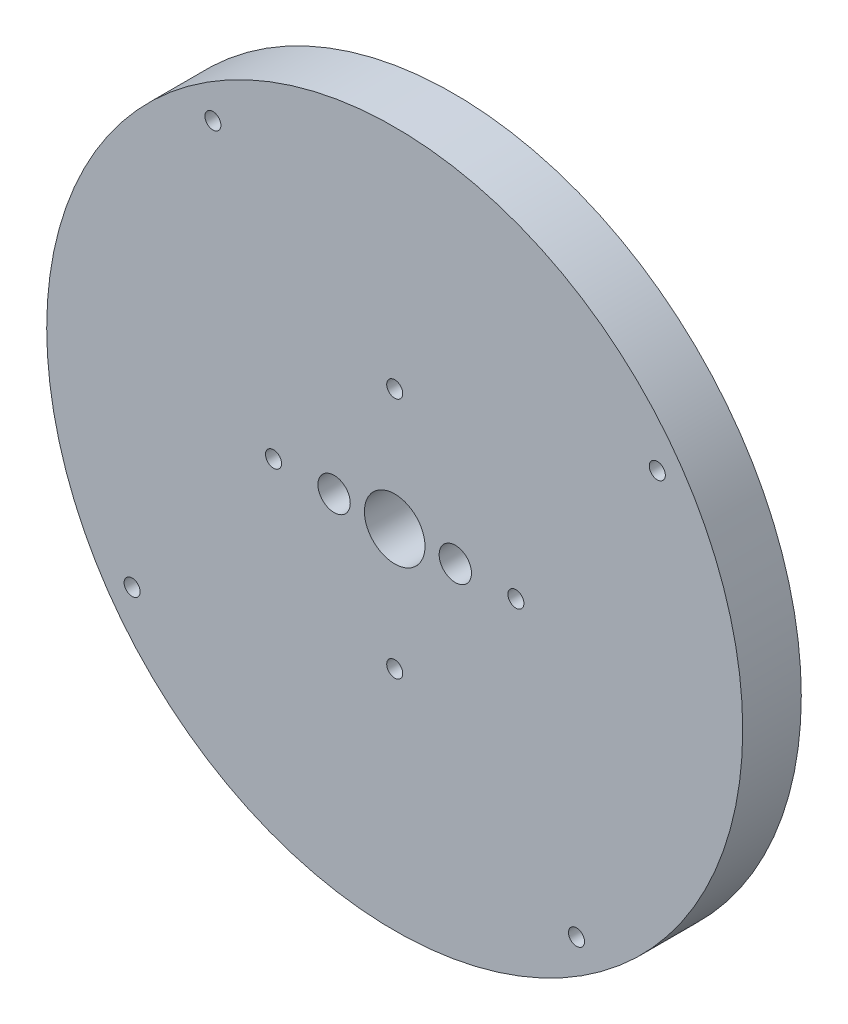
ISO-10303-21;
HEADER;
FILE_DESCRIPTION(('STEP AP214'),'2;1');
FILE_NAME('part.step','',(''),(''),'','','');
FILE_SCHEMA(('AUTOMOTIVE_DESIGN { 1 0 10303 214 1 1 1 1 }'));
ENDSEC;
DATA;
#1=APPLICATION_CONTEXT('core data for automotive mechanical design processes');
#2=APPLICATION_PROTOCOL_DEFINITION('international standard','automotive_design',2000,#1);
#3=PRODUCT_CONTEXT('',#1,'mechanical');
#4=PRODUCT('Part','Part','',(#3));
#5=PRODUCT_RELATED_PRODUCT_CATEGORY('part','',(#4));
#6=PRODUCT_DEFINITION_FORMATION('','',#4);
#7=PRODUCT_DEFINITION_CONTEXT('part definition',#1,'design');
#8=PRODUCT_DEFINITION('design','',#6,#7);
#9=PRODUCT_DEFINITION_SHAPE('','',#8);
#10=(LENGTH_UNIT() NAMED_UNIT(*) SI_UNIT(.MILLI.,.METRE.));
#11=(NAMED_UNIT(*) PLANE_ANGLE_UNIT() SI_UNIT($,.RADIAN.));
#12=(NAMED_UNIT(*) SI_UNIT($,.STERADIAN.) SOLID_ANGLE_UNIT());
#13=UNCERTAINTY_MEASURE_WITH_UNIT(LENGTH_MEASURE(1.E-05),#10,'distance_accuracy_value','');
#14=(GEOMETRIC_REPRESENTATION_CONTEXT(3) GLOBAL_UNCERTAINTY_ASSIGNED_CONTEXT((#13)) GLOBAL_UNIT_ASSIGNED_CONTEXT((#10,
#11,#12)) REPRESENTATION_CONTEXT('',''));
#15=CARTESIAN_POINT('',(0.,0.,0.));
#16=DIRECTION('',(0.,0.,1.));
#17=DIRECTION('',(1.,0.,0.));
#18=AXIS2_PLACEMENT_3D('',#15,#16,#17);
#19=CARTESIAN_POINT('',(0.,0.,5.8));
#20=DIRECTION('',(0.,0.,1.));
#21=DIRECTION('',(1.,0.,0.));
#22=AXIS2_PLACEMENT_3D('',#19,#20,#21);
#23=PLANE('',#22);
#24=CARTESIAN_POINT('',(-6.,0.,5.8));
#25=DIRECTION('',(0.,0.,1.));
#26=DIRECTION('',(1.,0.,0.));
#27=AXIS2_PLACEMENT_3D('',#24,#25,#26);
#28=CIRCLE('',#27,1.59999999999999);
#29=CARTESIAN_POINT('',(-4.40000000000001,0.,5.8));
#30=VERTEX_POINT('',#29);
#31=EDGE_CURVE('E63',#30,#30,#28,.T.);
#32=ORIENTED_EDGE('',*,*,#31,.F.);
#33=EDGE_LOOP('',(#32));
#34=FACE_BOUND('',#33,.T.);
#35=CARTESIAN_POINT('',(6.,0.,5.8));
#36=DIRECTION('',(0.,0.,1.));
#37=DIRECTION('',(1.,0.,0.));
#38=AXIS2_PLACEMENT_3D('',#35,#36,#37);
#39=CIRCLE('',#38,1.59999999999999);
#40=CARTESIAN_POINT('',(7.59999999999999,0.,5.8));
#41=VERTEX_POINT('',#40);
#42=EDGE_CURVE('E52',#41,#41,#39,.T.);
#43=ORIENTED_EDGE('',*,*,#42,.F.);
#44=EDGE_LOOP('',(#43));
#45=FACE_BOUND('',#44,.T.);
#46=CARTESIAN_POINT('',(-26.,-18.,5.8));
#47=DIRECTION('',(0.,0.,1.));
#48=DIRECTION('',(1.,0.,0.));
#49=AXIS2_PLACEMENT_3D('',#46,#47,#48);
#50=CIRCLE('',#49,0.793749999999999);
#51=CARTESIAN_POINT('',(-25.20625,-18.,5.8));
#52=VERTEX_POINT('',#51);
#53=EDGE_CURVE('E51',#52,#52,#50,.T.);
#54=ORIENTED_EDGE('',*,*,#53,.F.);
#55=EDGE_LOOP('',(#54));
#56=FACE_BOUND('',#55,.T.);
#57=CARTESIAN_POINT('',(18.,-26.,5.8));
#58=DIRECTION('',(0.,0.,1.));
#59=DIRECTION('',(1.,0.,0.));
#60=AXIS2_PLACEMENT_3D('',#57,#58,#59);
#61=CIRCLE('',#60,0.793749999999999);
#62=CARTESIAN_POINT('',(18.79375,-26.,5.8));
#63=VERTEX_POINT('',#62);
#64=EDGE_CURVE('E67',#63,#63,#61,.T.);
#65=ORIENTED_EDGE('',*,*,#64,.F.);
#66=EDGE_LOOP('',(#65));
#67=FACE_BOUND('',#66,.T.);
#68=CARTESIAN_POINT('',(26.,18.,5.8));
#69=DIRECTION('',(0.,0.,1.));
#70=DIRECTION('',(1.,0.,0.));
#71=AXIS2_PLACEMENT_3D('',#68,#69,#70);
#72=CIRCLE('',#71,0.793750000000094);
#73=CARTESIAN_POINT('',(26.7937500000001,18.,5.8));
#74=VERTEX_POINT('',#73);
#75=EDGE_CURVE('E72',#74,#74,#72,.T.);
#76=ORIENTED_EDGE('',*,*,#75,.F.);
#77=EDGE_LOOP('',(#76));
#78=FACE_BOUND('',#77,.T.);
#79=CARTESIAN_POINT('',(-11.9999999999998,-1.77032234820136E-13,5.8));
#80=DIRECTION('',(0.,0.,1.));
#81=DIRECTION('',(1.,0.,0.));
#82=AXIS2_PLACEMENT_3D('',#79,#80,#81);
#83=CIRCLE('',#82,0.793749999999992);
#84=CARTESIAN_POINT('',(-11.2062499999998,-1.77032234820136E-13,5.8));
#85=VERTEX_POINT('',#84);
#86=EDGE_CURVE('E78',#85,#85,#83,.T.);
#87=ORIENTED_EDGE('',*,*,#86,.F.);
#88=EDGE_LOOP('',(#87));
#89=FACE_BOUND('',#88,.T.);
#90=CARTESIAN_POINT('',(0.,-12.,5.8));
#91=DIRECTION('',(0.,0.,1.));
#92=DIRECTION('',(1.,0.,0.));
#93=AXIS2_PLACEMENT_3D('',#90,#91,#92);
#94=CIRCLE('',#93,0.79375);
#95=CARTESIAN_POINT('',(0.79375,-12.,5.8));
#96=VERTEX_POINT('',#95);
#97=EDGE_CURVE('E84',#96,#96,#94,.T.);
#98=ORIENTED_EDGE('',*,*,#97,.F.);
#99=EDGE_LOOP('',(#98));
#100=FACE_BOUND('',#99,.T.);
#101=CARTESIAN_POINT('',(12.0000000000002,0.,5.8));
#102=DIRECTION('',(0.,0.,1.));
#103=DIRECTION('',(1.,0.,0.));
#104=AXIS2_PLACEMENT_3D('',#101,#102,#103);
#105=CIRCLE('',#104,0.793749999999999);
#106=CARTESIAN_POINT('',(12.7937500000002,0.,5.8));
#107=VERTEX_POINT('',#106);
#108=EDGE_CURVE('E90',#107,#107,#105,.T.);
#109=ORIENTED_EDGE('',*,*,#108,.F.);
#110=EDGE_LOOP('',(#109));
#111=FACE_BOUND('',#110,.T.);
#112=CARTESIAN_POINT('',(-18.,26.,5.8));
#113=DIRECTION('',(0.,0.,1.));
#114=DIRECTION('',(1.,0.,0.));
#115=AXIS2_PLACEMENT_3D('',#112,#113,#114);
#116=CIRCLE('',#115,0.793749999999999);
#117=CARTESIAN_POINT('',(-17.20625,26.,5.8));
#118=VERTEX_POINT('',#117);
#119=EDGE_CURVE('E96',#118,#118,#116,.T.);
#120=ORIENTED_EDGE('',*,*,#119,.F.);
#121=EDGE_LOOP('',(#120));
#122=FACE_BOUND('',#121,.T.);
#123=CARTESIAN_POINT('',(0.,12.,5.8));
#124=DIRECTION('',(0.,0.,1.));
#125=DIRECTION('',(1.,0.,0.));
#126=AXIS2_PLACEMENT_3D('',#123,#124,#125);
#127=CIRCLE('',#126,0.79375);
#128=CARTESIAN_POINT('',(0.79375,12.,5.8));
#129=VERTEX_POINT('',#128);
#130=EDGE_CURVE('E102',#129,#129,#127,.T.);
#131=ORIENTED_EDGE('',*,*,#130,.F.);
#132=EDGE_LOOP('',(#131));
#133=FACE_BOUND('',#132,.T.);
#134=CARTESIAN_POINT('',(0.,0.,5.8));
#135=DIRECTION('',(0.,0.,1.));
#136=DIRECTION('',(1.,0.,0.));
#137=AXIS2_PLACEMENT_3D('',#134,#135,#136);
#138=CIRCLE('',#137,34.4583333333333);
#139=CARTESIAN_POINT('',(34.4583333333333,0.,5.8));
#140=VERTEX_POINT('',#139);
#141=EDGE_CURVE('E10',#140,#140,#138,.T.);
#142=ORIENTED_EDGE('',*,*,#141,.T.);
#143=EDGE_LOOP('',(#142));
#144=FACE_BOUND('',#143,.T.);
#145=CARTESIAN_POINT('',(0.,0.,5.8));
#146=DIRECTION('',(0.,0.,1.));
#147=DIRECTION('',(1.,0.,0.));
#148=AXIS2_PLACEMENT_3D('',#145,#146,#147);
#149=CIRCLE('',#148,3.);
#150=CARTESIAN_POINT('',(3.,0.,5.8));
#151=VERTEX_POINT('',#150);
#152=EDGE_CURVE('E44',#151,#151,#149,.T.);
#153=ORIENTED_EDGE('',*,*,#152,.F.);
#154=EDGE_LOOP('',(#153));
#155=FACE_BOUND('',#154,.T.);
#156=ADVANCED_FACE('F31',(#34,#45,#56,#67,#78,#89,#100,#111,#122,#133,#144,#155),#23,.T.);
#157=CARTESIAN_POINT('',(0.,0.,0.));
#158=DIRECTION('',(0.,0.,1.));
#159=DIRECTION('',(1.,0.,0.));
#160=AXIS2_PLACEMENT_3D('',#157,#158,#159);
#161=PLANE('',#160);
#162=CARTESIAN_POINT('',(-6.,0.,0.));
#163=DIRECTION('',(0.,0.,1.));
#164=DIRECTION('',(1.,0.,0.));
#165=AXIS2_PLACEMENT_3D('',#162,#163,#164);
#166=CIRCLE('',#165,1.59999999999999);
#167=CARTESIAN_POINT('',(-4.40000000000001,0.,0.));
#168=VERTEX_POINT('',#167);
#169=EDGE_CURVE('E35',#168,#168,#166,.T.);
#170=ORIENTED_EDGE('',*,*,#169,.T.);
#171=EDGE_LOOP('',(#170));
#172=FACE_BOUND('',#171,.T.);
#173=CARTESIAN_POINT('',(6.,0.,0.));
#174=DIRECTION('',(0.,0.,1.));
#175=DIRECTION('',(1.,0.,0.));
#176=AXIS2_PLACEMENT_3D('',#173,#174,#175);
#177=CIRCLE('',#176,1.59999999999999);
#178=CARTESIAN_POINT('',(7.59999999999999,0.,0.));
#179=VERTEX_POINT('',#178);
#180=EDGE_CURVE('E49',#179,#179,#177,.T.);
#181=ORIENTED_EDGE('',*,*,#180,.T.);
#182=EDGE_LOOP('',(#181));
#183=FACE_BOUND('',#182,.T.);
#184=CARTESIAN_POINT('',(-26.,-18.,0.));
#185=DIRECTION('',(0.,0.,1.));
#186=DIRECTION('',(1.,0.,0.));
#187=AXIS2_PLACEMENT_3D('',#184,#185,#186);
#188=CIRCLE('',#187,0.793749999999999);
#189=CARTESIAN_POINT('',(-25.20625,-18.,0.));
#190=VERTEX_POINT('',#189);
#191=EDGE_CURVE('E56',#190,#190,#188,.T.);
#192=ORIENTED_EDGE('',*,*,#191,.T.);
#193=EDGE_LOOP('',(#192));
#194=FACE_BOUND('',#193,.T.);
#195=CARTESIAN_POINT('',(18.,-26.,0.));
#196=DIRECTION('',(0.,0.,1.));
#197=DIRECTION('',(1.,0.,0.));
#198=AXIS2_PLACEMENT_3D('',#195,#196,#197);
#199=CIRCLE('',#198,0.793749999999999);
#200=CARTESIAN_POINT('',(18.79375,-26.,0.));
#201=VERTEX_POINT('',#200);
#202=EDGE_CURVE('E69',#201,#201,#199,.T.);
#203=ORIENTED_EDGE('',*,*,#202,.T.);
#204=EDGE_LOOP('',(#203));
#205=FACE_BOUND('',#204,.T.);
#206=CARTESIAN_POINT('',(26.,18.,0.));
#207=DIRECTION('',(0.,0.,1.));
#208=DIRECTION('',(1.,0.,0.));
#209=AXIS2_PLACEMENT_3D('',#206,#207,#208);
#210=CIRCLE('',#209,0.793750000000094);
#211=CARTESIAN_POINT('',(26.7937500000001,18.,0.));
#212=VERTEX_POINT('',#211);
#213=EDGE_CURVE('E75',#212,#212,#210,.T.);
#214=ORIENTED_EDGE('',*,*,#213,.T.);
#215=EDGE_LOOP('',(#214));
#216=FACE_BOUND('',#215,.T.);
#217=CARTESIAN_POINT('',(-11.9999999999998,-1.77032234820136E-13,0.));
#218=DIRECTION('',(0.,0.,1.));
#219=DIRECTION('',(1.,0.,0.));
#220=AXIS2_PLACEMENT_3D('',#217,#218,#219);
#221=CIRCLE('',#220,0.793749999999992);
#222=CARTESIAN_POINT('',(-11.2062499999998,-1.77032234820136E-13,0.));
#223=VERTEX_POINT('',#222);
#224=EDGE_CURVE('E81',#223,#223,#221,.T.);
#225=ORIENTED_EDGE('',*,*,#224,.T.);
#226=EDGE_LOOP('',(#225));
#227=FACE_BOUND('',#226,.T.);
#228=CARTESIAN_POINT('',(0.,-12.,0.));
#229=DIRECTION('',(0.,0.,1.));
#230=DIRECTION('',(1.,0.,0.));
#231=AXIS2_PLACEMENT_3D('',#228,#229,#230);
#232=CIRCLE('',#231,0.79375);
#233=CARTESIAN_POINT('',(0.79375,-12.,0.));
#234=VERTEX_POINT('',#233);
#235=EDGE_CURVE('E87',#234,#234,#232,.T.);
#236=ORIENTED_EDGE('',*,*,#235,.T.);
#237=EDGE_LOOP('',(#236));
#238=FACE_BOUND('',#237,.T.);
#239=CARTESIAN_POINT('',(12.0000000000002,0.,0.));
#240=DIRECTION('',(0.,0.,1.));
#241=DIRECTION('',(1.,0.,0.));
#242=AXIS2_PLACEMENT_3D('',#239,#240,#241);
#243=CIRCLE('',#242,0.793749999999999);
#244=CARTESIAN_POINT('',(12.7937500000002,0.,0.));
#245=VERTEX_POINT('',#244);
#246=EDGE_CURVE('E93',#245,#245,#243,.T.);
#247=ORIENTED_EDGE('',*,*,#246,.T.);
#248=EDGE_LOOP('',(#247));
#249=FACE_BOUND('',#248,.T.);
#250=CARTESIAN_POINT('',(-18.,26.,0.));
#251=DIRECTION('',(0.,0.,1.));
#252=DIRECTION('',(1.,0.,0.));
#253=AXIS2_PLACEMENT_3D('',#250,#251,#252);
#254=CIRCLE('',#253,0.793749999999999);
#255=CARTESIAN_POINT('',(-17.20625,26.,0.));
#256=VERTEX_POINT('',#255);
#257=EDGE_CURVE('E99',#256,#256,#254,.T.);
#258=ORIENTED_EDGE('',*,*,#257,.T.);
#259=EDGE_LOOP('',(#258));
#260=FACE_BOUND('',#259,.T.);
#261=CARTESIAN_POINT('',(0.,12.,0.));
#262=DIRECTION('',(0.,0.,1.));
#263=DIRECTION('',(1.,0.,0.));
#264=AXIS2_PLACEMENT_3D('',#261,#262,#263);
#265=CIRCLE('',#264,0.79375);
#266=CARTESIAN_POINT('',(0.79375,12.,0.));
#267=VERTEX_POINT('',#266);
#268=EDGE_CURVE('E105',#267,#267,#265,.T.);
#269=ORIENTED_EDGE('',*,*,#268,.T.);
#270=EDGE_LOOP('',(#269));
#271=FACE_BOUND('',#270,.T.);
#272=CARTESIAN_POINT('',(0.,0.,0.));
#273=DIRECTION('',(0.,0.,1.));
#274=DIRECTION('',(1.,0.,0.));
#275=AXIS2_PLACEMENT_3D('',#272,#273,#274);
#276=CIRCLE('',#275,34.4583333333333);
#277=CARTESIAN_POINT('',(34.4583333333333,0.,0.));
#278=VERTEX_POINT('',#277);
#279=EDGE_CURVE('E39',#278,#278,#276,.T.);
#280=ORIENTED_EDGE('',*,*,#279,.F.);
#281=EDGE_LOOP('',(#280));
#282=FACE_BOUND('',#281,.T.);
#283=CARTESIAN_POINT('',(0.,0.,0.));
#284=DIRECTION('',(0.,0.,1.));
#285=DIRECTION('',(1.,0.,0.));
#286=AXIS2_PLACEMENT_3D('',#283,#284,#285);
#287=CIRCLE('',#286,3.);
#288=CARTESIAN_POINT('',(3.,0.,0.));
#289=VERTEX_POINT('',#288);
#290=EDGE_CURVE('E47',#289,#289,#287,.T.);
#291=ORIENTED_EDGE('',*,*,#290,.T.);
#292=EDGE_LOOP('',(#291));
#293=FACE_BOUND('',#292,.T.);
#294=ADVANCED_FACE('F115',(#172,#183,#194,#205,#216,#227,#238,#249,#260,#271,#282,#293),#161,.F.);
#295=CARTESIAN_POINT('',(0.,0.,5.8));
#296=DIRECTION('',(0.,0.,-1.));
#297=DIRECTION('',(-1.,0.,0.));
#298=AXIS2_PLACEMENT_3D('',#295,#296,#297);
#299=CYLINDRICAL_SURFACE('',#298,34.4583333333333);
#300=ORIENTED_EDGE('',*,*,#141,.F.);
#301=EDGE_LOOP('',(#300));
#302=FACE_BOUND('',#301,.T.);
#303=ORIENTED_EDGE('',*,*,#279,.T.);
#304=EDGE_LOOP('',(#303));
#305=FACE_BOUND('',#304,.T.);
#306=ADVANCED_FACE('F33',(#302,#305),#299,.T.);
#307=CARTESIAN_POINT('',(0.,0.,5.8));
#308=DIRECTION('',(0.,0.,-1.));
#309=DIRECTION('',(-1.,0.,0.));
#310=AXIS2_PLACEMENT_3D('',#307,#308,#309);
#311=CYLINDRICAL_SURFACE('',#310,3.);
#312=ORIENTED_EDGE('',*,*,#152,.T.);
#313=EDGE_LOOP('',(#312));
#314=FACE_BOUND('',#313,.T.);
#315=ORIENTED_EDGE('',*,*,#290,.F.);
#316=EDGE_LOOP('',(#315));
#317=FACE_BOUND('',#316,.T.);
#318=ADVANCED_FACE('F117',(#314,#317),#311,.F.);
#319=CARTESIAN_POINT('',(0.,12.,0.));
#320=DIRECTION('',(0.,0.,1.));
#321=DIRECTION('',(1.,0.,0.));
#322=AXIS2_PLACEMENT_3D('',#319,#320,#321);
#323=CYLINDRICAL_SURFACE('',#322,0.79375);
#324=ORIENTED_EDGE('',*,*,#268,.F.);
#325=EDGE_LOOP('',(#324));
#326=FACE_BOUND('',#325,.T.);
#327=ORIENTED_EDGE('',*,*,#130,.T.);
#328=EDGE_LOOP('',(#327));
#329=FACE_BOUND('',#328,.T.);
#330=ADVANCED_FACE('F119',(#326,#329),#323,.F.);
#331=CARTESIAN_POINT('',(-18.,26.,0.));
#332=DIRECTION('',(0.,0.,1.));
#333=DIRECTION('',(1.,0.,0.));
#334=AXIS2_PLACEMENT_3D('',#331,#332,#333);
#335=CYLINDRICAL_SURFACE('',#334,0.793749999999999);
#336=ORIENTED_EDGE('',*,*,#257,.F.);
#337=EDGE_LOOP('',(#336));
#338=FACE_BOUND('',#337,.T.);
#339=ORIENTED_EDGE('',*,*,#119,.T.);
#340=EDGE_LOOP('',(#339));
#341=FACE_BOUND('',#340,.T.);
#342=ADVANCED_FACE('F125',(#338,#341),#335,.F.);
#343=CARTESIAN_POINT('',(12.0000000000002,0.,0.));
#344=DIRECTION('',(0.,0.,1.));
#345=DIRECTION('',(1.,0.,0.));
#346=AXIS2_PLACEMENT_3D('',#343,#344,#345);
#347=CYLINDRICAL_SURFACE('',#346,0.793749999999999);
#348=ORIENTED_EDGE('',*,*,#246,.F.);
#349=EDGE_LOOP('',(#348));
#350=FACE_BOUND('',#349,.T.);
#351=ORIENTED_EDGE('',*,*,#108,.T.);
#352=EDGE_LOOP('',(#351));
#353=FACE_BOUND('',#352,.T.);
#354=ADVANCED_FACE('F159',(#350,#353),#347,.F.);
#355=CARTESIAN_POINT('',(0.,-12.,0.));
#356=DIRECTION('',(0.,0.,1.));
#357=DIRECTION('',(1.,0.,0.));
#358=AXIS2_PLACEMENT_3D('',#355,#356,#357);
#359=CYLINDRICAL_SURFACE('',#358,0.79375);
#360=ORIENTED_EDGE('',*,*,#235,.F.);
#361=EDGE_LOOP('',(#360));
#362=FACE_BOUND('',#361,.T.);
#363=ORIENTED_EDGE('',*,*,#97,.T.);
#364=EDGE_LOOP('',(#363));
#365=FACE_BOUND('',#364,.T.);
#366=ADVANCED_FACE('F165',(#362,#365),#359,.F.);
#367=CARTESIAN_POINT('',(-11.9999999999998,-1.77032234820136E-13,0.));
#368=DIRECTION('',(0.,0.,1.));
#369=DIRECTION('',(1.,0.,0.));
#370=AXIS2_PLACEMENT_3D('',#367,#368,#369);
#371=CYLINDRICAL_SURFACE('',#370,0.793749999999992);
#372=ORIENTED_EDGE('',*,*,#224,.F.);
#373=EDGE_LOOP('',(#372));
#374=FACE_BOUND('',#373,.T.);
#375=ORIENTED_EDGE('',*,*,#86,.T.);
#376=EDGE_LOOP('',(#375));
#377=FACE_BOUND('',#376,.T.);
#378=ADVANCED_FACE('F172',(#374,#377),#371,.F.);
#379=CARTESIAN_POINT('',(26.,18.,0.));
#380=DIRECTION('',(0.,0.,1.));
#381=DIRECTION('',(1.,0.,0.));
#382=AXIS2_PLACEMENT_3D('',#379,#380,#381);
#383=CYLINDRICAL_SURFACE('',#382,0.793750000000094);
#384=ORIENTED_EDGE('',*,*,#213,.F.);
#385=EDGE_LOOP('',(#384));
#386=FACE_BOUND('',#385,.T.);
#387=ORIENTED_EDGE('',*,*,#75,.T.);
#388=EDGE_LOOP('',(#387));
#389=FACE_BOUND('',#388,.T.);
#390=ADVANCED_FACE('F176',(#386,#389),#383,.F.);
#391=CARTESIAN_POINT('',(18.,-26.,0.));
#392=DIRECTION('',(0.,0.,1.));
#393=DIRECTION('',(1.,0.,0.));
#394=AXIS2_PLACEMENT_3D('',#391,#392,#393);
#395=CYLINDRICAL_SURFACE('',#394,0.793749999999999);
#396=ORIENTED_EDGE('',*,*,#202,.F.);
#397=EDGE_LOOP('',(#396));
#398=FACE_BOUND('',#397,.T.);
#399=ORIENTED_EDGE('',*,*,#64,.T.);
#400=EDGE_LOOP('',(#399));
#401=FACE_BOUND('',#400,.T.);
#402=ADVANCED_FACE('F180',(#398,#401),#395,.F.);
#403=CARTESIAN_POINT('',(-26.,-18.,0.));
#404=DIRECTION('',(0.,0.,1.));
#405=DIRECTION('',(1.,0.,0.));
#406=AXIS2_PLACEMENT_3D('',#403,#404,#405);
#407=CYLINDRICAL_SURFACE('',#406,0.793749999999999);
#408=ORIENTED_EDGE('',*,*,#191,.F.);
#409=EDGE_LOOP('',(#408));
#410=FACE_BOUND('',#409,.T.);
#411=ORIENTED_EDGE('',*,*,#53,.T.);
#412=EDGE_LOOP('',(#411));
#413=FACE_BOUND('',#412,.T.);
#414=ADVANCED_FACE('F184',(#410,#413),#407,.F.);
#415=CARTESIAN_POINT('',(6.,0.,5.8));
#416=DIRECTION('',(0.,0.,1.));
#417=DIRECTION('',(1.,0.,0.));
#418=AXIS2_PLACEMENT_3D('',#415,#416,#417);
#419=CYLINDRICAL_SURFACE('',#418,1.59999999999999);
#420=ORIENTED_EDGE('',*,*,#42,.T.);
#421=EDGE_LOOP('',(#420));
#422=FACE_BOUND('',#421,.T.);
#423=ORIENTED_EDGE('',*,*,#180,.F.);
#424=EDGE_LOOP('',(#423));
#425=FACE_BOUND('',#424,.T.);
#426=ADVANCED_FACE('F188',(#422,#425),#419,.F.);
#427=CARTESIAN_POINT('',(-6.,0.,5.8));
#428=DIRECTION('',(0.,0.,1.));
#429=DIRECTION('',(1.,0.,0.));
#430=AXIS2_PLACEMENT_3D('',#427,#428,#429);
#431=CYLINDRICAL_SURFACE('',#430,1.59999999999999);
#432=ORIENTED_EDGE('',*,*,#31,.T.);
#433=EDGE_LOOP('',(#432));
#434=FACE_BOUND('',#433,.T.);
#435=ORIENTED_EDGE('',*,*,#169,.F.);
#436=EDGE_LOOP('',(#435));
#437=FACE_BOUND('',#436,.T.);
#438=ADVANCED_FACE('F192',(#434,#437),#431,.F.);
#439=CLOSED_SHELL('',(#156,#294,#306,#318,#330,#342,#354,#366,#378,#390,#402,#414,#426,#438));
#440=MANIFOLD_SOLID_BREP('B2',#439);
#441=ADVANCED_BREP_SHAPE_REPRESENTATION('',(#18,#440),#14);
#442=SHAPE_DEFINITION_REPRESENTATION(#9,#441);
ENDSEC;
END-ISO-10303-21;
